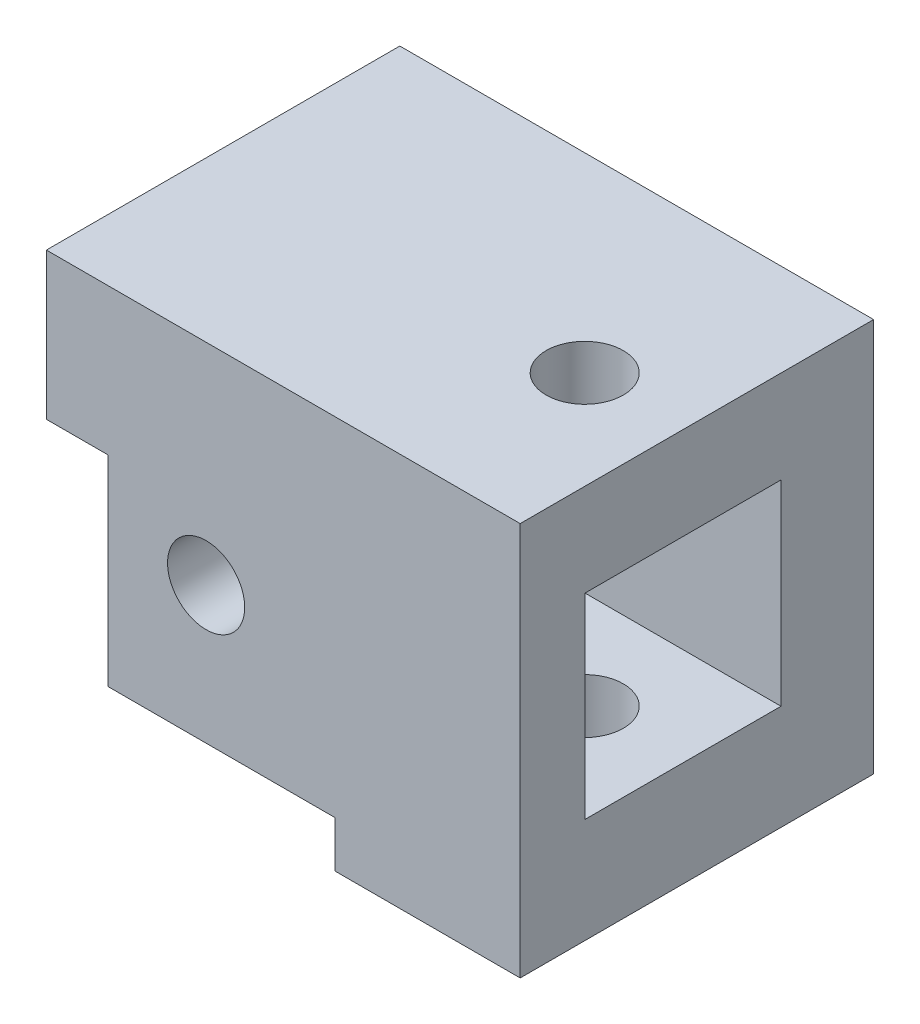
ISO-10303-21;
HEADER;
FILE_DESCRIPTION(('STEP AP214'),'2;1');
FILE_NAME('part.step','',(''),(''),'','','');
FILE_SCHEMA(('AUTOMOTIVE_DESIGN { 1 0 10303 214 1 1 1 1 }'));
ENDSEC;
DATA;
#1=APPLICATION_CONTEXT('core data for automotive mechanical design processes');
#2=APPLICATION_PROTOCOL_DEFINITION('international standard','automotive_design',2000,#1);
#3=PRODUCT_CONTEXT('',#1,'mechanical');
#4=PRODUCT('Part','Part','',(#3));
#5=PRODUCT_RELATED_PRODUCT_CATEGORY('part','',(#4));
#6=PRODUCT_DEFINITION_FORMATION('','',#4);
#7=PRODUCT_DEFINITION_CONTEXT('part definition',#1,'design');
#8=PRODUCT_DEFINITION('design','',#6,#7);
#9=PRODUCT_DEFINITION_SHAPE('','',#8);
#10=(LENGTH_UNIT() NAMED_UNIT(*) SI_UNIT(.MILLI.,.METRE.));
#11=(NAMED_UNIT(*) PLANE_ANGLE_UNIT() SI_UNIT($,.RADIAN.));
#12=(NAMED_UNIT(*) SI_UNIT($,.STERADIAN.) SOLID_ANGLE_UNIT());
#13=UNCERTAINTY_MEASURE_WITH_UNIT(LENGTH_MEASURE(1.E-05),#10,'distance_accuracy_value','');
#14=(GEOMETRIC_REPRESENTATION_CONTEXT(3) GLOBAL_UNCERTAINTY_ASSIGNED_CONTEXT((#13)) GLOBAL_UNIT_ASSIGNED_CONTEXT((#10,
#11,#12)) REPRESENTATION_CONTEXT('',''));
#15=CARTESIAN_POINT('',(0.,0.,0.));
#16=DIRECTION('',(0.,0.,1.));
#17=DIRECTION('',(1.,0.,0.));
#18=AXIS2_PLACEMENT_3D('',#15,#16,#17);
#19=CARTESIAN_POINT('',(-12.7,-10.5,-12.45));
#20=DIRECTION('',(0.,1.,0.));
#21=DIRECTION('',(0.,0.,1.));
#22=AXIS2_PLACEMENT_3D('',#19,#20,#21);
#23=PLANE('',#22);
#24=DIRECTION('',(0.,0.,-1.));
#25=VECTOR('',#24,1.);
#26=CARTESIAN_POINT('',(2.,-10.5,8.45));
#27=LINE('',#26,#25);
#28=CARTESIAN_POINT('',(2.,-10.5,8.45));
#29=VERTEX_POINT('',#28);
#30=CARTESIAN_POINT('',(2.00000000000001,-10.5,-14.45));
#31=VERTEX_POINT('',#30);
#32=EDGE_CURVE('E59',#29,#31,#27,.T.);
#33=ORIENTED_EDGE('',*,*,#32,.F.);
#34=DIRECTION('',(-1.,0.,0.));
#35=VECTOR('',#34,1.);
#36=CARTESIAN_POINT('',(-12.7,-10.5,8.45));
#37=LINE('',#36,#35);
#38=CARTESIAN_POINT('',(-12.7,-10.5,8.45));
#39=VERTEX_POINT('',#38);
#40=EDGE_CURVE('E271',#29,#39,#37,.T.);
#41=ORIENTED_EDGE('',*,*,#40,.T.);
#42=DIRECTION('',(0.,0.,1.));
#43=VECTOR('',#42,1.);
#44=CARTESIAN_POINT('',(-12.7,-10.5,-12.45));
#45=LINE('',#44,#43);
#46=CARTESIAN_POINT('',(-12.7,-10.5,4.25));
#47=VERTEX_POINT('',#46);
#48=EDGE_CURVE('E274',#47,#39,#45,.T.);
#49=ORIENTED_EDGE('',*,*,#48,.F.);
#50=DIRECTION('',(-1.,0.,0.));
#51=VECTOR('',#50,1.);
#52=CARTESIAN_POINT('',(0.,-10.5,4.25));
#53=LINE('',#52,#51);
#54=CARTESIAN_POINT('',(0.,-10.5,4.25));
#55=VERTEX_POINT('',#54);
#56=EDGE_CURVE('E278',#55,#47,#53,.T.);
#57=ORIENTED_EDGE('',*,*,#56,.F.);
#58=DIRECTION('',(0.,0.,1.));
#59=VECTOR('',#58,1.);
#60=CARTESIAN_POINT('',(0.,-10.5,4.25));
#61=LINE('',#60,#59);
#62=CARTESIAN_POINT('',(0.,-10.5,-8.45));
#63=VERTEX_POINT('',#62);
#64=EDGE_CURVE('E268',#63,#55,#61,.T.);
#65=ORIENTED_EDGE('',*,*,#64,.F.);
#66=DIRECTION('',(1.,0.,0.));
#67=VECTOR('',#66,1.);
#68=CARTESIAN_POINT('',(-35.98626204439,-10.5,-8.45));
#69=LINE('',#68,#67);
#70=CARTESIAN_POINT('',(-12.7,-10.5,-8.45));
#71=VERTEX_POINT('',#70);
#72=EDGE_CURVE('E242',#71,#63,#69,.T.);
#73=ORIENTED_EDGE('',*,*,#72,.F.);
#74=DIRECTION('',(0.,0.,-1.));
#75=VECTOR('',#74,1.);
#76=CARTESIAN_POINT('',(-12.7,-10.5,-8.45));
#77=LINE('',#76,#75);
#78=CARTESIAN_POINT('',(-12.7,-10.5,-14.45));
#79=VERTEX_POINT('',#78);
#80=EDGE_CURVE('E230',#71,#79,#77,.T.);
#81=ORIENTED_EDGE('',*,*,#80,.T.);
#82=DIRECTION('',(1.,0.,0.));
#83=VECTOR('',#82,1.);
#84=CARTESIAN_POINT('',(-35.98626204439,-10.5,-14.45));
#85=LINE('',#84,#83);
#86=EDGE_CURVE('E237',#79,#31,#85,.T.);
#87=ORIENTED_EDGE('',*,*,#86,.T.);
#88=EDGE_LOOP('',(#33,#41,#49,#57,#65,#73,#81,#87));
#89=FACE_BOUND('',#88,.T.);
#90=ADVANCED_FACE('F40',(#89),#23,.F.);
#91=CARTESIAN_POINT('',(-12.7,0.,0.));
#92=DIRECTION('',(-1.,0.,0.));
#93=DIRECTION('',(0.,0.,1.));
#94=AXIS2_PLACEMENT_3D('',#91,#92,#93);
#95=PLANE('',#94);
#96=DIRECTION('',(0.,0.,1.));
#97=VECTOR('',#96,1.);
#98=CARTESIAN_POINT('',(-12.7,2.5,8.45));
#99=LINE('',#98,#97);
#100=CARTESIAN_POINT('',(-12.7,2.5,-14.45));
#101=VERTEX_POINT('',#100);
#102=CARTESIAN_POINT('',(-12.7,2.5,-8.45));
#103=VERTEX_POINT('',#102);
#104=EDGE_CURVE('E51',#101,#103,#99,.T.);
#105=ORIENTED_EDGE('',*,*,#104,.F.);
#106=DIRECTION('',(0.,1.,0.));
#107=VECTOR('',#106,1.);
#108=CARTESIAN_POINT('',(-12.7,12.,-14.45));
#109=LINE('',#108,#107);
#110=EDGE_CURVE('E244',#79,#101,#109,.T.);
#111=ORIENTED_EDGE('',*,*,#110,.F.);
#112=ORIENTED_EDGE('',*,*,#80,.F.);
#113=DIRECTION('',(0.,-1.,0.));
#114=VECTOR('',#113,1.);
#115=CARTESIAN_POINT('',(-12.7,12.,-8.45));
#116=LINE('',#115,#114);
#117=EDGE_CURVE('E243',#103,#71,#116,.T.);
#118=ORIENTED_EDGE('',*,*,#117,.F.);
#119=EDGE_LOOP('',(#105,#111,#112,#118));
#120=FACE_BOUND('',#119,.T.);
#121=ADVANCED_FACE('F359',(#120),#95,.T.);
#122=CARTESIAN_POINT('',(0.,6.,4.25));
#123=DIRECTION('',(0.,0.,1.));
#124=DIRECTION('',(0.,-1.,0.));
#125=AXIS2_PLACEMENT_3D('',#122,#123,#124);
#126=PLANE('',#125);
#127=CARTESIAN_POINT('',(-6.35,-1.63,4.25));
#128=DIRECTION('',(0.,0.,1.));
#129=DIRECTION('',(0.,-1.,0.));
#130=AXIS2_PLACEMENT_3D('',#127,#128,#129);
#131=CIRCLE('',#130,2.5);
#132=CARTESIAN_POINT('',(-6.35,-4.13,4.25));
#133=VERTEX_POINT('',#132);
#134=EDGE_CURVE('E295',#133,#133,#131,.T.);
#135=ORIENTED_EDGE('',*,*,#134,.T.);
#136=EDGE_LOOP('',(#135));
#137=FACE_BOUND('',#136,.T.);
#138=DIRECTION('',(1.,0.,0.));
#139=VECTOR('',#138,1.);
#140=CARTESIAN_POINT('',(0.,-6.7,4.25));
#141=LINE('',#140,#139);
#142=CARTESIAN_POINT('',(0.,-6.7,4.25));
#143=VERTEX_POINT('',#142);
#144=CARTESIAN_POINT('',(14.,-6.7,4.25));
#145=VERTEX_POINT('',#144);
#146=EDGE_CURVE('E325',#143,#145,#141,.T.);
#147=ORIENTED_EDGE('',*,*,#146,.F.);
#148=DIRECTION('',(0.,1.,0.));
#149=VECTOR('',#148,1.);
#150=CARTESIAN_POINT('',(0.,-6.7,4.25));
#151=LINE('',#150,#149);
#152=EDGE_CURVE('E256',#55,#143,#151,.T.);
#153=ORIENTED_EDGE('',*,*,#152,.F.);
#154=ORIENTED_EDGE('',*,*,#56,.T.);
#155=DIRECTION('',(0.,-1.,0.));
#156=VECTOR('',#155,1.);
#157=CARTESIAN_POINT('',(-12.7,6.,4.25));
#158=LINE('',#157,#156);
#159=CARTESIAN_POINT('',(-12.7,2.5,4.25));
#160=VERTEX_POINT('',#159);
#161=EDGE_CURVE('E303',#160,#47,#158,.T.);
#162=ORIENTED_EDGE('',*,*,#161,.F.);
#163=CARTESIAN_POINT('',(-12.7,6.,4.25));
#164=VERTEX_POINT('',#163);
#165=EDGE_CURVE('E304',#164,#160,#158,.T.);
#166=ORIENTED_EDGE('',*,*,#165,.F.);
#167=DIRECTION('',(1.,0.,0.));
#168=VECTOR('',#167,1.);
#169=CARTESIAN_POINT('',(0.,6.,4.25));
#170=LINE('',#169,#168);
#171=CARTESIAN_POINT('',(14.,6.,4.25));
#172=VERTEX_POINT('',#171);
#173=EDGE_CURVE('E328',#164,#172,#170,.T.);
#174=ORIENTED_EDGE('',*,*,#173,.T.);
#175=DIRECTION('',(0.,-1.,0.));
#176=VECTOR('',#175,1.);
#177=CARTESIAN_POINT('',(14.,6.,4.25));
#178=LINE('',#177,#176);
#179=EDGE_CURVE('E159',#172,#145,#178,.T.);
#180=ORIENTED_EDGE('',*,*,#179,.T.);
#181=EDGE_LOOP('',(#147,#153,#154,#162,#166,#174,#180));
#182=FACE_BOUND('',#181,.T.);
#183=ADVANCED_FACE('F366',(#137,#182),#126,.F.);
#184=CARTESIAN_POINT('',(17.,-12.,8.45));
#185=DIRECTION('',(0.,0.,-1.));
#186=DIRECTION('',(-1.,0.,0.));
#187=AXIS2_PLACEMENT_3D('',#184,#185,#186);
#188=PLANE('',#187);
#189=CARTESIAN_POINT('',(-6.35,-1.63,8.45));
#190=DIRECTION('',(0.,0.,1.));
#191=DIRECTION('',(1.,0.,0.));
#192=AXIS2_PLACEMENT_3D('',#189,#190,#191);
#193=CIRCLE('',#192,2.5);
#194=CARTESIAN_POINT('',(-3.85,-1.63,8.45));
#195=VERTEX_POINT('',#194);
#196=EDGE_CURVE('E291',#195,#195,#193,.T.);
#197=ORIENTED_EDGE('',*,*,#196,.F.);
#198=EDGE_LOOP('',(#197));
#199=FACE_BOUND('',#198,.T.);
#200=DIRECTION('',(-1.,0.,0.));
#201=VECTOR('',#200,1.);
#202=CARTESIAN_POINT('',(17.,12.,8.45));
#203=LINE('',#202,#201);
#204=CARTESIAN_POINT('',(14.,12.,8.45));
#205=VERTEX_POINT('',#204);
#206=CARTESIAN_POINT('',(-16.7,12.,8.45));
#207=VERTEX_POINT('',#206);
#208=EDGE_CURVE('E324',#205,#207,#203,.T.);
#209=ORIENTED_EDGE('',*,*,#208,.T.);
#210=DIRECTION('',(0.,1.,0.));
#211=VECTOR('',#210,1.);
#212=CARTESIAN_POINT('',(-16.7,12.,8.45));
#213=LINE('',#212,#211);
#214=CARTESIAN_POINT('',(-16.7,2.5,8.45));
#215=VERTEX_POINT('',#214);
#216=EDGE_CURVE('E208',#215,#207,#213,.T.);
#217=ORIENTED_EDGE('',*,*,#216,.F.);
#218=DIRECTION('',(1.,0.,0.));
#219=VECTOR('',#218,1.);
#220=CARTESIAN_POINT('',(-16.7,2.5,8.45));
#221=LINE('',#220,#219);
#222=CARTESIAN_POINT('',(-12.7,2.5,8.45));
#223=VERTEX_POINT('',#222);
#224=EDGE_CURVE('E215',#215,#223,#221,.T.);
#225=ORIENTED_EDGE('',*,*,#224,.T.);
#226=DIRECTION('',(0.,1.,0.));
#227=VECTOR('',#226,1.);
#228=CARTESIAN_POINT('',(-12.7,-12.,8.45));
#229=LINE('',#228,#227);
#230=EDGE_CURVE('E308',#39,#223,#229,.T.);
#231=ORIENTED_EDGE('',*,*,#230,.F.);
#232=ORIENTED_EDGE('',*,*,#40,.F.);
#233=DIRECTION('',(0.,1.,0.));
#234=VECTOR('',#233,1.);
#235=CARTESIAN_POINT('',(2.,-13.5,8.45));
#236=LINE('',#235,#234);
#237=CARTESIAN_POINT('',(2.,-13.5,8.45));
#238=VERTEX_POINT('',#237);
#239=EDGE_CURVE('E165',#238,#29,#236,.T.);
#240=ORIENTED_EDGE('',*,*,#239,.F.);
#241=DIRECTION('',(-1.,0.,0.));
#242=VECTOR('',#241,1.);
#243=CARTESIAN_POINT('',(14.,-13.5,8.45));
#244=LINE('',#243,#242);
#245=CARTESIAN_POINT('',(14.,-13.5,8.45));
#246=VERTEX_POINT('',#245);
#247=EDGE_CURVE('E162',#246,#238,#244,.T.);
#248=ORIENTED_EDGE('',*,*,#247,.F.);
#249=DIRECTION('',(0.,1.,0.));
#250=VECTOR('',#249,1.);
#251=CARTESIAN_POINT('',(14.,-12.,8.45));
#252=LINE('',#251,#250);
#253=EDGE_CURVE('E149',#246,#205,#252,.T.);
#254=ORIENTED_EDGE('',*,*,#253,.T.);
#255=EDGE_LOOP('',(#209,#217,#225,#231,#232,#240,#248,#254));
#256=FACE_BOUND('',#255,.T.);
#257=ADVANCED_FACE('F163',(#199,#256),#188,.F.);
#258=CARTESIAN_POINT('',(0.,-6.7,-8.45));
#259=DIRECTION('',(0.,-1.,0.));
#260=DIRECTION('',(0.,0.,-1.));
#261=AXIS2_PLACEMENT_3D('',#258,#259,#260);
#262=PLANE('',#261);
#263=CARTESIAN_POINT('',(7.63,-6.7,-2.1));
#264=DIRECTION('',(0.,-1.,0.));
#265=DIRECTION('',(0.,0.,-1.));
#266=AXIS2_PLACEMENT_3D('',#263,#264,#265);
#267=CIRCLE('',#266,2.5);
#268=CARTESIAN_POINT('',(7.63,-6.7,-4.6));
#269=VERTEX_POINT('',#268);
#270=EDGE_CURVE('E316',#269,#269,#267,.T.);
#271=ORIENTED_EDGE('',*,*,#270,.T.);
#272=EDGE_LOOP('',(#271));
#273=FACE_BOUND('',#272,.T.);
#274=DIRECTION('',(1.,0.,0.));
#275=VECTOR('',#274,1.);
#276=CARTESIAN_POINT('',(0.,-6.7,-8.45));
#277=LINE('',#276,#275);
#278=CARTESIAN_POINT('',(0.,-6.7,-8.45));
#279=VERTEX_POINT('',#278);
#280=CARTESIAN_POINT('',(14.,-6.69999999999999,-8.45));
#281=VERTEX_POINT('',#280);
#282=EDGE_CURVE('E321',#279,#281,#277,.T.);
#283=ORIENTED_EDGE('',*,*,#282,.F.);
#284=DIRECTION('',(0.,0.,-1.));
#285=VECTOR('',#284,1.);
#286=CARTESIAN_POINT('',(0.,-6.7,4.25));
#287=LINE('',#286,#285);
#288=EDGE_CURVE('E260',#143,#279,#287,.T.);
#289=ORIENTED_EDGE('',*,*,#288,.F.);
#290=ORIENTED_EDGE('',*,*,#146,.T.);
#291=DIRECTION('',(0.,0.,-1.));
#292=VECTOR('',#291,1.);
#293=CARTESIAN_POINT('',(14.,-6.7,-8.45));
#294=LINE('',#293,#292);
#295=EDGE_CURVE('E287',#145,#281,#294,.T.);
#296=ORIENTED_EDGE('',*,*,#295,.T.);
#297=EDGE_LOOP('',(#283,#289,#290,#296));
#298=FACE_BOUND('',#297,.T.);
#299=ADVANCED_FACE('F443',(#273,#298),#262,.F.);
#300=CARTESIAN_POINT('',(17.,12.,8.45));
#301=DIRECTION('',(0.,-1.,0.));
#302=DIRECTION('',(0.,0.,-1.));
#303=AXIS2_PLACEMENT_3D('',#300,#301,#302);
#304=PLANE('',#303);
#305=CARTESIAN_POINT('',(7.63,12.,-2.1));
#306=DIRECTION('',(0.,1.,0.));
#307=DIRECTION('',(0.,0.,1.));
#308=AXIS2_PLACEMENT_3D('',#305,#306,#307);
#309=CIRCLE('',#308,2.5);
#310=CARTESIAN_POINT('',(7.63,12.,0.4));
#311=VERTEX_POINT('',#310);
#312=EDGE_CURVE('E311',#311,#311,#309,.T.);
#313=ORIENTED_EDGE('',*,*,#312,.F.);
#314=EDGE_LOOP('',(#313));
#315=FACE_BOUND('',#314,.T.);
#316=DIRECTION('',(1.,0.,0.));
#317=VECTOR('',#316,1.);
#318=CARTESIAN_POINT('',(-35.98626204439,12.,-14.45));
#319=LINE('',#318,#317);
#320=CARTESIAN_POINT('',(-16.7,12.,-14.45));
#321=VERTEX_POINT('',#320);
#322=CARTESIAN_POINT('',(14.,12.,-14.45));
#323=VERTEX_POINT('',#322);
#324=EDGE_CURVE('E248',#321,#323,#319,.T.);
#325=ORIENTED_EDGE('',*,*,#324,.F.);
#326=DIRECTION('',(0.,0.,-1.));
#327=VECTOR('',#326,1.);
#328=CARTESIAN_POINT('',(-16.7,12.,-14.45));
#329=LINE('',#328,#327);
#330=EDGE_CURVE('E212',#207,#321,#329,.T.);
#331=ORIENTED_EDGE('',*,*,#330,.F.);
#332=ORIENTED_EDGE('',*,*,#208,.F.);
#333=DIRECTION('',(0.,0.,1.));
#334=VECTOR('',#333,1.);
#335=CARTESIAN_POINT('',(14.,12.,8.45));
#336=LINE('',#335,#334);
#337=EDGE_CURVE('E155',#323,#205,#336,.T.);
#338=ORIENTED_EDGE('',*,*,#337,.F.);
#339=EDGE_LOOP('',(#325,#331,#332,#338));
#340=FACE_BOUND('',#339,.T.);
#341=ADVANCED_FACE('F42',(#315,#340),#304,.F.);
#342=CARTESIAN_POINT('',(0.,6.,-8.45));
#343=DIRECTION('',(0.,1.,0.));
#344=DIRECTION('',(0.,0.,1.));
#345=AXIS2_PLACEMENT_3D('',#342,#343,#344);
#346=PLANE('',#345);
#347=CARTESIAN_POINT('',(7.63,6.,-2.1));
#348=DIRECTION('',(0.,1.,0.));
#349=DIRECTION('',(0.,0.,1.));
#350=AXIS2_PLACEMENT_3D('',#347,#348,#349);
#351=CIRCLE('',#350,2.5);
#352=CARTESIAN_POINT('',(7.63,6.,0.4));
#353=VERTEX_POINT('',#352);
#354=EDGE_CURVE('E315',#353,#353,#351,.T.);
#355=ORIENTED_EDGE('',*,*,#354,.T.);
#356=EDGE_LOOP('',(#355));
#357=FACE_BOUND('',#356,.T.);
#358=DIRECTION('',(1.,0.,0.));
#359=VECTOR('',#358,1.);
#360=CARTESIAN_POINT('',(0.,6.,-8.45));
#361=LINE('',#360,#359);
#362=CARTESIAN_POINT('',(-12.7,6.,-8.45));
#363=VERTEX_POINT('',#362);
#364=CARTESIAN_POINT('',(14.,6.,-8.45));
#365=VERTEX_POINT('',#364);
#366=EDGE_CURVE('E320',#363,#365,#361,.T.);
#367=ORIENTED_EDGE('',*,*,#366,.T.);
#368=DIRECTION('',(0.,0.,1.));
#369=VECTOR('',#368,1.);
#370=CARTESIAN_POINT('',(14.,6.,-8.45));
#371=LINE('',#370,#369);
#372=EDGE_CURVE('E44',#365,#172,#371,.T.);
#373=ORIENTED_EDGE('',*,*,#372,.T.);
#374=ORIENTED_EDGE('',*,*,#173,.F.);
#375=DIRECTION('',(0.,0.,1.));
#376=VECTOR('',#375,1.);
#377=CARTESIAN_POINT('',(-12.7,6.,-8.45));
#378=LINE('',#377,#376);
#379=EDGE_CURVE('E299',#363,#164,#378,.T.);
#380=ORIENTED_EDGE('',*,*,#379,.F.);
#381=EDGE_LOOP('',(#367,#373,#374,#380));
#382=FACE_BOUND('',#381,.T.);
#383=ADVANCED_FACE('F340',(#357,#382),#346,.F.);
#384=CARTESIAN_POINT('',(7.63,-12.,-2.1));
#385=DIRECTION('',(0.,1.,0.));
#386=DIRECTION('',(0.,0.,1.));
#387=AXIS2_PLACEMENT_3D('',#384,#385,#386);
#388=CYLINDRICAL_SURFACE('',#387,2.5);
#389=ORIENTED_EDGE('',*,*,#312,.T.);
#390=EDGE_LOOP('',(#389));
#391=FACE_BOUND('',#390,.T.);
#392=ORIENTED_EDGE('',*,*,#354,.F.);
#393=EDGE_LOOP('',(#392));
#394=FACE_BOUND('',#393,.T.);
#395=ADVANCED_FACE('F343',(#391,#394),#388,.F.);
#396=ORIENTED_EDGE('',*,*,#270,.F.);
#397=EDGE_LOOP('',(#396));
#398=FACE_BOUND('',#397,.T.);
#399=CARTESIAN_POINT('',(7.63,-13.5,-2.1));
#400=DIRECTION('',(0.,-1.,0.));
#401=DIRECTION('',(0.,0.,-1.));
#402=AXIS2_PLACEMENT_3D('',#399,#400,#401);
#403=CIRCLE('',#402,2.5);
#404=CARTESIAN_POINT('',(7.63,-13.5,-4.6));
#405=VERTEX_POINT('',#404);
#406=EDGE_CURVE('E179',#405,#405,#403,.T.);
#407=ORIENTED_EDGE('',*,*,#406,.T.);
#408=EDGE_LOOP('',(#407));
#409=FACE_BOUND('',#408,.T.);
#410=ADVANCED_FACE('F345',(#398,#409),#388,.F.);
#411=EDGE_CURVE('E12',#160,#223,#99,.T.);
#412=ORIENTED_EDGE('',*,*,#411,.F.);
#413=ORIENTED_EDGE('',*,*,#161,.T.);
#414=ORIENTED_EDGE('',*,*,#48,.T.);
#415=ORIENTED_EDGE('',*,*,#230,.T.);
#416=EDGE_LOOP('',(#412,#413,#414,#415));
#417=FACE_BOUND('',#416,.T.);
#418=ADVANCED_FACE('F353',(#417),#95,.T.);
#419=CARTESIAN_POINT('',(-6.35,-1.63,-12.45));
#420=DIRECTION('',(0.,0.,1.));
#421=DIRECTION('',(1.,0.,0.));
#422=AXIS2_PLACEMENT_3D('',#419,#420,#421);
#423=CYLINDRICAL_SURFACE('',#422,2.5);
#424=ORIENTED_EDGE('',*,*,#196,.T.);
#425=EDGE_LOOP('',(#424));
#426=FACE_BOUND('',#425,.T.);
#427=ORIENTED_EDGE('',*,*,#134,.F.);
#428=EDGE_LOOP('',(#427));
#429=FACE_BOUND('',#428,.T.);
#430=ADVANCED_FACE('F374',(#426,#429),#423,.F.);
#431=CARTESIAN_POINT('',(14.,-12.,8.45));
#432=DIRECTION('',(-1.,0.,0.));
#433=DIRECTION('',(0.,0.,1.));
#434=AXIS2_PLACEMENT_3D('',#431,#432,#433);
#435=PLANE('',#434);
#436=DIRECTION('',(0.,-1.,0.));
#437=VECTOR('',#436,1.);
#438=CARTESIAN_POINT('',(14.,12.,-8.45));
#439=LINE('',#438,#437);
#440=EDGE_CURVE('E226',#365,#281,#439,.T.);
#441=ORIENTED_EDGE('',*,*,#440,.T.);
#442=ORIENTED_EDGE('',*,*,#295,.F.);
#443=ORIENTED_EDGE('',*,*,#179,.F.);
#444=ORIENTED_EDGE('',*,*,#372,.F.);
#445=EDGE_LOOP('',(#441,#442,#443,#444));
#446=FACE_BOUND('',#445,.T.);
#447=ORIENTED_EDGE('',*,*,#253,.F.);
#448=DIRECTION('',(0.,0.,1.));
#449=VECTOR('',#448,1.);
#450=CARTESIAN_POINT('',(14.,-13.5,8.45));
#451=LINE('',#450,#449);
#452=CARTESIAN_POINT('',(14.,-13.5,-14.45));
#453=VERTEX_POINT('',#452);
#454=EDGE_CURVE('E154',#453,#246,#451,.T.);
#455=ORIENTED_EDGE('',*,*,#454,.F.);
#456=DIRECTION('',(0.,1.,0.));
#457=VECTOR('',#456,1.);
#458=CARTESIAN_POINT('',(14.,12.,-14.45));
#459=LINE('',#458,#457);
#460=EDGE_CURVE('E227',#453,#323,#459,.T.);
#461=ORIENTED_EDGE('',*,*,#460,.T.);
#462=ORIENTED_EDGE('',*,*,#337,.T.);
#463=EDGE_LOOP('',(#447,#455,#461,#462));
#464=FACE_BOUND('',#463,.T.);
#465=ADVANCED_FACE('F151',(#446,#464),#435,.F.);
#466=CARTESIAN_POINT('',(0.,0.,0.));
#467=DIRECTION('',(1.,0.,0.));
#468=DIRECTION('',(0.,0.,-1.));
#469=AXIS2_PLACEMENT_3D('',#466,#467,#468);
#470=PLANE('',#469);
#471=ORIENTED_EDGE('',*,*,#152,.T.);
#472=ORIENTED_EDGE('',*,*,#288,.T.);
#473=DIRECTION('',(0.,-1.,0.));
#474=VECTOR('',#473,1.);
#475=CARTESIAN_POINT('',(0.,-6.7,-8.45));
#476=LINE('',#475,#474);
#477=EDGE_CURVE('E264',#279,#63,#476,.T.);
#478=ORIENTED_EDGE('',*,*,#477,.T.);
#479=ORIENTED_EDGE('',*,*,#64,.T.);
#480=EDGE_LOOP('',(#471,#472,#478,#479));
#481=FACE_BOUND('',#480,.T.);
#482=ADVANCED_FACE('F370',(#481),#470,.F.);
#483=CARTESIAN_POINT('',(-35.98626204439,12.,-8.45));
#484=DIRECTION('',(0.,0.,1.));
#485=DIRECTION('',(0.,-1.,0.));
#486=AXIS2_PLACEMENT_3D('',#483,#484,#485);
#487=PLANE('',#486);
#488=CARTESIAN_POINT('',(-6.35,-1.63,-8.45));
#489=DIRECTION('',(0.,0.,1.));
#490=DIRECTION('',(0.,-1.,0.));
#491=AXIS2_PLACEMENT_3D('',#488,#489,#490);
#492=CIRCLE('',#491,2.5);
#493=CARTESIAN_POINT('',(-6.35,-4.13,-8.45));
#494=VERTEX_POINT('',#493);
#495=EDGE_CURVE('E197',#494,#494,#492,.T.);
#496=ORIENTED_EDGE('',*,*,#495,.F.);
#497=EDGE_LOOP('',(#496));
#498=FACE_BOUND('',#497,.T.);
#499=ORIENTED_EDGE('',*,*,#366,.F.);
#500=EDGE_CURVE('E238',#363,#103,#116,.T.);
#501=ORIENTED_EDGE('',*,*,#500,.T.);
#502=ORIENTED_EDGE('',*,*,#117,.T.);
#503=ORIENTED_EDGE('',*,*,#72,.T.);
#504=ORIENTED_EDGE('',*,*,#477,.F.);
#505=ORIENTED_EDGE('',*,*,#282,.T.);
#506=ORIENTED_EDGE('',*,*,#440,.F.);
#507=EDGE_LOOP('',(#499,#501,#502,#503,#504,#505,#506));
#508=FACE_BOUND('',#507,.T.);
#509=ADVANCED_FACE('F393',(#498,#508),#487,.T.);
#510=CARTESIAN_POINT('',(-35.98626204439,12.,-14.45));
#511=DIRECTION('',(0.,0.,-1.));
#512=DIRECTION('',(0.,1.,0.));
#513=AXIS2_PLACEMENT_3D('',#510,#511,#512);
#514=PLANE('',#513);
#515=CARTESIAN_POINT('',(-6.35,-1.63,-14.45));
#516=DIRECTION('',(0.,0.,1.));
#517=DIRECTION('',(1.,0.,0.));
#518=AXIS2_PLACEMENT_3D('',#515,#516,#517);
#519=CIRCLE('',#518,2.5);
#520=CARTESIAN_POINT('',(-3.85,-1.63,-14.45));
#521=VERTEX_POINT('',#520);
#522=EDGE_CURVE('E193',#521,#521,#519,.T.);
#523=ORIENTED_EDGE('',*,*,#522,.T.);
#524=EDGE_LOOP('',(#523));
#525=FACE_BOUND('',#524,.T.);
#526=ORIENTED_EDGE('',*,*,#86,.F.);
#527=ORIENTED_EDGE('',*,*,#110,.T.);
#528=DIRECTION('',(1.,0.,0.));
#529=VECTOR('',#528,1.);
#530=CARTESIAN_POINT('',(-16.7,2.5,-14.45));
#531=LINE('',#530,#529);
#532=CARTESIAN_POINT('',(-16.7,2.5,-14.45));
#533=VERTEX_POINT('',#532);
#534=EDGE_CURVE('E222',#533,#101,#531,.T.);
#535=ORIENTED_EDGE('',*,*,#534,.F.);
#536=DIRECTION('',(0.,-1.,0.));
#537=VECTOR('',#536,1.);
#538=CARTESIAN_POINT('',(-16.7,2.5,-14.45));
#539=LINE('',#538,#537);
#540=EDGE_CURVE('E201',#321,#533,#539,.T.);
#541=ORIENTED_EDGE('',*,*,#540,.F.);
#542=ORIENTED_EDGE('',*,*,#324,.T.);
#543=ORIENTED_EDGE('',*,*,#460,.F.);
#544=DIRECTION('',(1.,0.,0.));
#545=VECTOR('',#544,1.);
#546=CARTESIAN_POINT('',(14.,-13.5,-14.45));
#547=LINE('',#546,#545);
#548=CARTESIAN_POINT('',(2.00000000000001,-13.5,-14.45));
#549=VERTEX_POINT('',#548);
#550=EDGE_CURVE('E175',#549,#453,#547,.T.);
#551=ORIENTED_EDGE('',*,*,#550,.F.);
#552=DIRECTION('',(0.,1.,0.));
#553=VECTOR('',#552,1.);
#554=CARTESIAN_POINT('',(2.00000000000001,-13.5,-14.45));
#555=LINE('',#554,#553);
#556=EDGE_CURVE('E186',#549,#31,#555,.T.);
#557=ORIENTED_EDGE('',*,*,#556,.T.);
#558=EDGE_LOOP('',(#526,#527,#535,#541,#542,#543,#551,#557));
#559=FACE_BOUND('',#558,.T.);
#560=ADVANCED_FACE('F401',(#525,#559),#514,.T.);
#561=CARTESIAN_POINT('',(-12.7,0.,0.));
#562=DIRECTION('',(1.,0.,0.));
#563=DIRECTION('',(0.,0.,-1.));
#564=AXIS2_PLACEMENT_3D('',#561,#562,#563);
#565=PLANE('',#564);
#566=ORIENTED_EDGE('',*,*,#500,.F.);
#567=ORIENTED_EDGE('',*,*,#379,.T.);
#568=ORIENTED_EDGE('',*,*,#165,.T.);
#569=EDGE_CURVE('E52',#103,#160,#99,.T.);
#570=ORIENTED_EDGE('',*,*,#569,.F.);
#571=EDGE_LOOP('',(#566,#567,#568,#570));
#572=FACE_BOUND('',#571,.T.);
#573=ADVANCED_FACE('F407',(#572),#565,.T.);
#574=CARTESIAN_POINT('',(-16.7,2.5,8.45));
#575=DIRECTION('',(0.,1.,0.));
#576=DIRECTION('',(0.,0.,1.));
#577=AXIS2_PLACEMENT_3D('',#574,#575,#576);
#578=PLANE('',#577);
#579=ORIENTED_EDGE('',*,*,#104,.T.);
#580=ORIENTED_EDGE('',*,*,#569,.T.);
#581=ORIENTED_EDGE('',*,*,#411,.T.);
#582=ORIENTED_EDGE('',*,*,#224,.F.);
#583=DIRECTION('',(0.,0.,1.));
#584=VECTOR('',#583,1.);
#585=CARTESIAN_POINT('',(-16.7,2.5,8.45));
#586=LINE('',#585,#584);
#587=EDGE_CURVE('E205',#533,#215,#586,.T.);
#588=ORIENTED_EDGE('',*,*,#587,.F.);
#589=ORIENTED_EDGE('',*,*,#534,.T.);
#590=EDGE_LOOP('',(#579,#580,#581,#582,#588,#589));
#591=FACE_BOUND('',#590,.T.);
#592=ADVANCED_FACE('F410',(#591),#578,.F.);
#593=CARTESIAN_POINT('',(-16.7,0.,0.));
#594=DIRECTION('',(1.,0.,0.));
#595=DIRECTION('',(0.,0.,-1.));
#596=AXIS2_PLACEMENT_3D('',#593,#594,#595);
#597=PLANE('',#596);
#598=ORIENTED_EDGE('',*,*,#540,.T.);
#599=ORIENTED_EDGE('',*,*,#587,.T.);
#600=ORIENTED_EDGE('',*,*,#216,.T.);
#601=ORIENTED_EDGE('',*,*,#330,.T.);
#602=EDGE_LOOP('',(#598,#599,#600,#601));
#603=FACE_BOUND('',#602,.T.);
#604=ADVANCED_FACE('F418',(#603),#597,.F.);
#605=CARTESIAN_POINT('',(-6.35,-1.63,-14.45));
#606=DIRECTION('',(0.,0.,1.));
#607=DIRECTION('',(1.,0.,0.));
#608=AXIS2_PLACEMENT_3D('',#605,#606,#607);
#609=CYLINDRICAL_SURFACE('',#608,2.5);
#610=ORIENTED_EDGE('',*,*,#495,.T.);
#611=EDGE_LOOP('',(#610));
#612=FACE_BOUND('',#611,.T.);
#613=ORIENTED_EDGE('',*,*,#522,.F.);
#614=EDGE_LOOP('',(#613));
#615=FACE_BOUND('',#614,.T.);
#616=ADVANCED_FACE('F425',(#612,#615),#609,.F.);
#617=CARTESIAN_POINT('',(0.,-13.5,0.));
#618=DIRECTION('',(0.,1.,0.));
#619=DIRECTION('',(0.,0.,1.));
#620=AXIS2_PLACEMENT_3D('',#617,#618,#619);
#621=PLANE('',#620);
#622=ORIENTED_EDGE('',*,*,#454,.T.);
#623=ORIENTED_EDGE('',*,*,#247,.T.);
#624=DIRECTION('',(0.,0.,-1.));
#625=VECTOR('',#624,1.);
#626=CARTESIAN_POINT('',(2.,-13.5,8.45));
#627=LINE('',#626,#625);
#628=EDGE_CURVE('E169',#238,#549,#627,.T.);
#629=ORIENTED_EDGE('',*,*,#628,.T.);
#630=ORIENTED_EDGE('',*,*,#550,.T.);
#631=EDGE_LOOP('',(#622,#623,#629,#630));
#632=FACE_BOUND('',#631,.T.);
#633=ORIENTED_EDGE('',*,*,#406,.F.);
#634=EDGE_LOOP('',(#633));
#635=FACE_BOUND('',#634,.T.);
#636=ADVANCED_FACE('F172',(#632,#635),#621,.F.);
#637=CARTESIAN_POINT('',(2.,-13.5,8.45));
#638=DIRECTION('',(1.,0.,0.));
#639=DIRECTION('',(0.,0.,-1.));
#640=AXIS2_PLACEMENT_3D('',#637,#638,#639);
#641=PLANE('',#640);
#642=ORIENTED_EDGE('',*,*,#32,.T.);
#643=ORIENTED_EDGE('',*,*,#556,.F.);
#644=ORIENTED_EDGE('',*,*,#628,.F.);
#645=ORIENTED_EDGE('',*,*,#239,.T.);
#646=EDGE_LOOP('',(#642,#643,#644,#645));
#647=FACE_BOUND('',#646,.T.);
#648=ADVANCED_FACE('F465',(#647),#641,.F.);
#649=CLOSED_SHELL('',(#90,#121,#183,#257,#299,#341,#383,#395,#410,#418,#430,#465,#482,#509,#560,
#573,#592,#604,#616,#636,#648));
#650=MANIFOLD_SOLID_BREP('B2',#649);
#651=ADVANCED_BREP_SHAPE_REPRESENTATION('',(#18,#650),#14);
#652=SHAPE_DEFINITION_REPRESENTATION(#9,#651);
ENDSEC;
END-ISO-10303-21;
